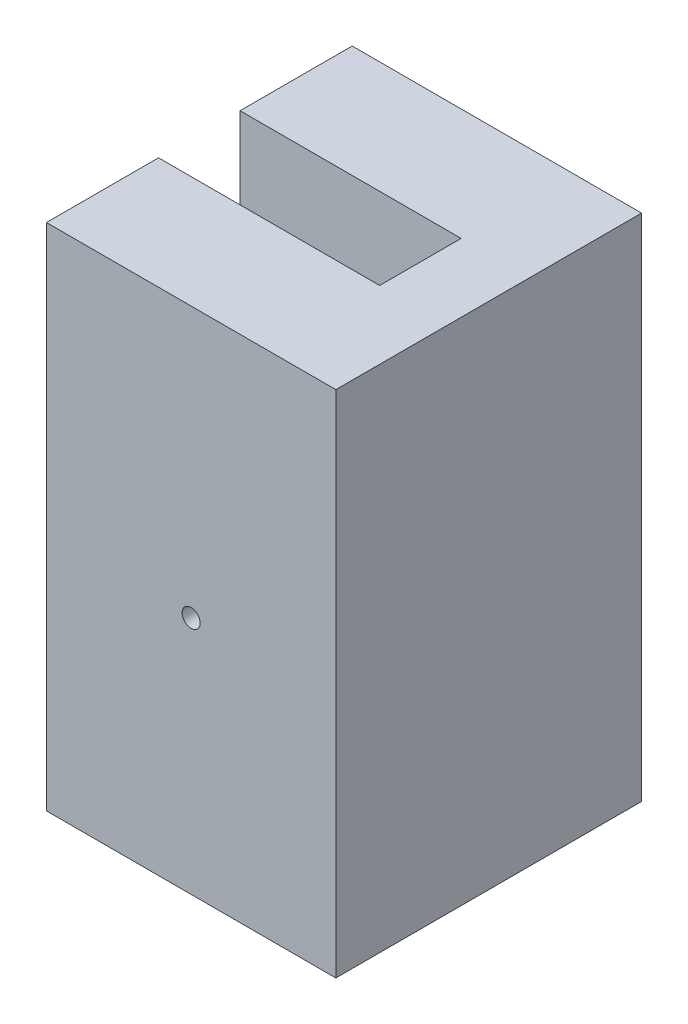
ISO-10303-21;
HEADER;
FILE_DESCRIPTION(('STEP AP214'),'2;1');
FILE_NAME('part.step','',(''),(''),'','','');
FILE_SCHEMA(('AUTOMOTIVE_DESIGN { 1 0 10303 214 1 1 1 1 }'));
ENDSEC;
DATA;
#1=APPLICATION_CONTEXT('core data for automotive mechanical design processes');
#2=APPLICATION_PROTOCOL_DEFINITION('international standard','automotive_design',2000,#1);
#3=PRODUCT_CONTEXT('',#1,'mechanical');
#4=PRODUCT('Part','Part','',(#3));
#5=PRODUCT_RELATED_PRODUCT_CATEGORY('part','',(#4));
#6=PRODUCT_DEFINITION_FORMATION('','',#4);
#7=PRODUCT_DEFINITION_CONTEXT('part definition',#1,'design');
#8=PRODUCT_DEFINITION('design','',#6,#7);
#9=PRODUCT_DEFINITION_SHAPE('','',#8);
#10=(LENGTH_UNIT() NAMED_UNIT(*) SI_UNIT(.MILLI.,.METRE.));
#11=(NAMED_UNIT(*) PLANE_ANGLE_UNIT() SI_UNIT($,.RADIAN.));
#12=(NAMED_UNIT(*) SI_UNIT($,.STERADIAN.) SOLID_ANGLE_UNIT());
#13=UNCERTAINTY_MEASURE_WITH_UNIT(LENGTH_MEASURE(1.E-05),#10,'distance_accuracy_value','');
#14=(GEOMETRIC_REPRESENTATION_CONTEXT(3) GLOBAL_UNCERTAINTY_ASSIGNED_CONTEXT((#13)) GLOBAL_UNIT_ASSIGNED_CONTEXT((#10,
#11,#12)) REPRESENTATION_CONTEXT('',''));
#15=CARTESIAN_POINT('',(0.,0.,0.));
#16=DIRECTION('',(0.,0.,1.));
#17=DIRECTION('',(1.,0.,0.));
#18=AXIS2_PLACEMENT_3D('',#15,#16,#17);
#19=CARTESIAN_POINT('',(-18.034,25.4,5.08));
#20=DIRECTION('',(0.,0.,1.));
#21=DIRECTION('',(1.,0.,0.));
#22=AXIS2_PLACEMENT_3D('',#19,#20,#21);
#23=PLANE('',#22);
#24=CARTESIAN_POINT('',(0.,29.845,5.08));
#25=DIRECTION('',(0.,0.,1.));
#26=DIRECTION('',(1.,0.,0.));
#27=AXIS2_PLACEMENT_3D('',#24,#25,#26);
#28=CIRCLE('',#27,1.125);
#29=CARTESIAN_POINT('',(1.125,29.845,5.08));
#30=VERTEX_POINT('',#29);
#31=EDGE_CURVE('E176',#30,#30,#28,.T.);
#32=ORIENTED_EDGE('',*,*,#31,.T.);
#33=EDGE_LOOP('',(#32));
#34=FACE_BOUND('',#33,.T.);
#35=DIRECTION('',(0.,-1.,0.));
#36=VECTOR('',#35,1.);
#37=CARTESIAN_POINT('',(9.525,25.4,5.08));
#38=LINE('',#37,#36);
#39=CARTESIAN_POINT('',(9.525,63.5,5.08));
#40=VERTEX_POINT('',#39);
#41=CARTESIAN_POINT('',(9.525,25.4,5.08));
#42=VERTEX_POINT('',#41);
#43=EDGE_CURVE('E167',#40,#42,#38,.T.);
#44=ORIENTED_EDGE('',*,*,#43,.T.);
#45=DIRECTION('',(1.,0.,0.));
#46=VECTOR('',#45,1.);
#47=CARTESIAN_POINT('',(-18.034,25.4,5.08));
#48=LINE('',#47,#46);
#49=CARTESIAN_POINT('',(-0.635,25.4,5.08));
#50=VERTEX_POINT('',#49);
#51=EDGE_CURVE('E52',#50,#42,#48,.T.);
#52=ORIENTED_EDGE('',*,*,#51,.F.);
#53=DIRECTION('',(0.,1.,0.));
#54=VECTOR('',#53,1.);
#55=CARTESIAN_POINT('',(-0.635,0.,5.08));
#56=LINE('',#55,#54);
#57=CARTESIAN_POINT('',(-0.635,19.05,5.08));
#58=VERTEX_POINT('',#57);
#59=EDGE_CURVE('E181',#58,#50,#56,.T.);
#60=ORIENTED_EDGE('',*,*,#59,.F.);
#61=DIRECTION('',(1.,0.,0.));
#62=VECTOR('',#61,1.);
#63=CARTESIAN_POINT('',(0.,19.05,5.08));
#64=LINE('',#63,#62);
#65=CARTESIAN_POINT('',(-18.034,19.05,5.08));
#66=VERTEX_POINT('',#65);
#67=EDGE_CURVE('E45',#66,#58,#64,.T.);
#68=ORIENTED_EDGE('',*,*,#67,.F.);
#69=DIRECTION('',(0.,1.,0.));
#70=VECTOR('',#69,1.);
#71=CARTESIAN_POINT('',(-18.034,25.4,5.08));
#72=LINE('',#71,#70);
#73=CARTESIAN_POINT('',(-18.034,63.5,5.08));
#74=VERTEX_POINT('',#73);
#75=EDGE_CURVE('E207',#66,#74,#72,.T.);
#76=ORIENTED_EDGE('',*,*,#75,.T.);
#77=DIRECTION('',(1.,0.,0.));
#78=VECTOR('',#77,1.);
#79=CARTESIAN_POINT('',(-18.034,63.5,5.08));
#80=LINE('',#79,#78);
#81=EDGE_CURVE('E60',#74,#40,#80,.T.);
#82=ORIENTED_EDGE('',*,*,#81,.T.);
#83=EDGE_LOOP('',(#44,#52,#60,#68,#76,#82));
#84=FACE_BOUND('',#83,.T.);
#85=ADVANCED_FACE('F37',(#34,#84),#23,.F.);
#86=CARTESIAN_POINT('',(-18.034,25.4,-5.08));
#87=DIRECTION('',(0.,0.,-1.));
#88=DIRECTION('',(-1.,0.,0.));
#89=AXIS2_PLACEMENT_3D('',#86,#87,#88);
#90=PLANE('',#89);
#91=CARTESIAN_POINT('',(0.,29.845,-5.08));
#92=DIRECTION('',(0.,0.,-1.));
#93=DIRECTION('',(-1.,0.,0.));
#94=AXIS2_PLACEMENT_3D('',#91,#92,#93);
#95=CIRCLE('',#94,1.125);
#96=CARTESIAN_POINT('',(-1.125,29.845,-5.08));
#97=VERTEX_POINT('',#96);
#98=EDGE_CURVE('E175',#97,#97,#95,.T.);
#99=ORIENTED_EDGE('',*,*,#98,.T.);
#100=EDGE_LOOP('',(#99));
#101=FACE_BOUND('',#100,.T.);
#102=DIRECTION('',(-1.,0.,0.));
#103=VECTOR('',#102,1.);
#104=CARTESIAN_POINT('',(-18.034,25.4,-5.08));
#105=LINE('',#104,#103);
#106=CARTESIAN_POINT('',(9.525,25.4,-5.08));
#107=VERTEX_POINT('',#106);
#108=CARTESIAN_POINT('',(-0.635,25.4,-5.08));
#109=VERTEX_POINT('',#108);
#110=EDGE_CURVE('E140',#107,#109,#105,.T.);
#111=ORIENTED_EDGE('',*,*,#110,.F.);
#112=DIRECTION('',(0.,1.,0.));
#113=VECTOR('',#112,1.);
#114=CARTESIAN_POINT('',(9.525,25.4,-5.08));
#115=LINE('',#114,#113);
#116=CARTESIAN_POINT('',(9.525,63.5,-5.08));
#117=VERTEX_POINT('',#116);
#118=EDGE_CURVE('E143',#107,#117,#115,.T.);
#119=ORIENTED_EDGE('',*,*,#118,.T.);
#120=DIRECTION('',(-1.,0.,0.));
#121=VECTOR('',#120,1.);
#122=CARTESIAN_POINT('',(-18.034,63.5,-5.08));
#123=LINE('',#122,#121);
#124=CARTESIAN_POINT('',(-18.034,63.5,-5.08));
#125=VERTEX_POINT('',#124);
#126=EDGE_CURVE('E194',#117,#125,#123,.T.);
#127=ORIENTED_EDGE('',*,*,#126,.T.);
#128=DIRECTION('',(0.,1.,0.));
#129=VECTOR('',#128,1.);
#130=CARTESIAN_POINT('',(-18.034,25.4,-5.08));
#131=LINE('',#130,#129);
#132=CARTESIAN_POINT('',(-18.034,19.05,-5.08));
#133=VERTEX_POINT('',#132);
#134=EDGE_CURVE('E204',#133,#125,#131,.T.);
#135=ORIENTED_EDGE('',*,*,#134,.F.);
#136=DIRECTION('',(-1.,0.,0.));
#137=VECTOR('',#136,1.);
#138=CARTESIAN_POINT('',(0.,19.05,-5.08));
#139=LINE('',#138,#137);
#140=CARTESIAN_POINT('',(-0.635,19.05,-5.08));
#141=VERTEX_POINT('',#140);
#142=EDGE_CURVE('E246',#141,#133,#139,.T.);
#143=ORIENTED_EDGE('',*,*,#142,.F.);
#144=DIRECTION('',(0.,1.,0.));
#145=VECTOR('',#144,1.);
#146=CARTESIAN_POINT('',(-0.635,0.,-5.08));
#147=LINE('',#146,#145);
#148=EDGE_CURVE('E146',#141,#109,#147,.T.);
#149=ORIENTED_EDGE('',*,*,#148,.T.);
#150=EDGE_LOOP('',(#111,#119,#127,#135,#143,#149));
#151=FACE_BOUND('',#150,.T.);
#152=ADVANCED_FACE('F141',(#101,#151),#90,.F.);
#153=CARTESIAN_POINT('',(9.525,-39.0386101315096,-19.05));
#154=DIRECTION('',(-1.,0.,0.));
#155=DIRECTION('',(0.,0.,1.));
#156=AXIS2_PLACEMENT_3D('',#153,#154,#155);
#157=PLANE('',#156);
#158=ORIENTED_EDGE('',*,*,#118,.F.);
#159=DIRECTION('',(0.,0.,-1.));
#160=VECTOR('',#159,1.);
#161=CARTESIAN_POINT('',(9.525,25.4,5.08));
#162=LINE('',#161,#160);
#163=EDGE_CURVE('E149',#42,#107,#162,.T.);
#164=ORIENTED_EDGE('',*,*,#163,.F.);
#165=ORIENTED_EDGE('',*,*,#43,.F.);
#166=DIRECTION('',(0.,0.,1.));
#167=VECTOR('',#166,1.);
#168=CARTESIAN_POINT('',(9.525,63.5,-19.05));
#169=LINE('',#168,#167);
#170=EDGE_CURVE('E152',#117,#40,#169,.T.);
#171=ORIENTED_EDGE('',*,*,#170,.F.);
#172=EDGE_LOOP('',(#158,#164,#165,#171));
#173=FACE_BOUND('',#172,.T.);
#174=ADVANCED_FACE('F155',(#173),#157,.T.);
#175=DIRECTION('',(0.,0.,1.));
#176=VECTOR('',#175,1.);
#177=CARTESIAN_POINT('',(9.525,19.05,0.));
#178=LINE('',#177,#176);
#179=CARTESIAN_POINT('',(9.525,19.05,-8.5725));
#180=VERTEX_POINT('',#179);
#181=CARTESIAN_POINT('',(9.525,19.05,8.5725));
#182=VERTEX_POINT('',#181);
#183=EDGE_CURVE('E161',#180,#182,#178,.T.);
#184=ORIENTED_EDGE('',*,*,#183,.F.);
#185=DIRECTION('',(0.,1.,0.));
#186=VECTOR('',#185,1.);
#187=CARTESIAN_POINT('',(9.525,65.3355937604538,-8.5725));
#188=LINE('',#187,#186);
#189=CARTESIAN_POINT('',(9.525,0.,-8.5725));
#190=VERTEX_POINT('',#189);
#191=EDGE_CURVE('E12',#190,#180,#188,.T.);
#192=ORIENTED_EDGE('',*,*,#191,.F.);
#193=DIRECTION('',(0.,0.,-1.));
#194=VECTOR('',#193,1.);
#195=CARTESIAN_POINT('',(9.525,0.,-19.05));
#196=LINE('',#195,#194);
#197=CARTESIAN_POINT('',(9.525,0.,8.5725));
#198=VERTEX_POINT('',#197);
#199=EDGE_CURVE('E158',#198,#190,#196,.T.);
#200=ORIENTED_EDGE('',*,*,#199,.F.);
#201=DIRECTION('',(0.,-1.,0.));
#202=VECTOR('',#201,1.);
#203=CARTESIAN_POINT('',(9.525,65.3355937604538,8.5725));
#204=LINE('',#203,#202);
#205=EDGE_CURVE('E157',#182,#198,#204,.T.);
#206=ORIENTED_EDGE('',*,*,#205,.F.);
#207=EDGE_LOOP('',(#184,#192,#200,#206));
#208=FACE_BOUND('',#207,.T.);
#209=ADVANCED_FACE('F339',(#208),#157,.T.);
#210=CARTESIAN_POINT('',(-18.034,63.5,-19.05));
#211=DIRECTION('',(1.,0.,0.));
#212=DIRECTION('',(0.,0.,-1.));
#213=AXIS2_PLACEMENT_3D('',#210,#211,#212);
#214=PLANE('',#213);
#215=ORIENTED_EDGE('',*,*,#75,.F.);
#216=DIRECTION('',(0.,0.,-1.));
#217=VECTOR('',#216,1.);
#218=CARTESIAN_POINT('',(-18.034,19.05,-8.5725));
#219=LINE('',#218,#217);
#220=CARTESIAN_POINT('',(-18.034,19.05,8.5725));
#221=VERTEX_POINT('',#220);
#222=EDGE_CURVE('E196',#221,#66,#219,.T.);
#223=ORIENTED_EDGE('',*,*,#222,.F.);
#224=DIRECTION('',(0.,-1.,0.));
#225=VECTOR('',#224,1.);
#226=CARTESIAN_POINT('',(-18.034,65.3355937604538,8.5725));
#227=LINE('',#226,#225);
#228=CARTESIAN_POINT('',(-18.034,0.,8.5725));
#229=VERTEX_POINT('',#228);
#230=EDGE_CURVE('E190',#221,#229,#227,.T.);
#231=ORIENTED_EDGE('',*,*,#230,.T.);
#232=DIRECTION('',(0.,0.,1.));
#233=VECTOR('',#232,1.);
#234=CARTESIAN_POINT('',(-18.034,0.,-19.05));
#235=LINE('',#234,#233);
#236=CARTESIAN_POINT('',(-18.034,0.,19.05));
#237=VERTEX_POINT('',#236);
#238=EDGE_CURVE('E227',#229,#237,#235,.T.);
#239=ORIENTED_EDGE('',*,*,#238,.T.);
#240=DIRECTION('',(0.,-1.,0.));
#241=VECTOR('',#240,1.);
#242=CARTESIAN_POINT('',(-18.034,63.5,19.05));
#243=LINE('',#242,#241);
#244=CARTESIAN_POINT('',(-18.034,63.5,19.05));
#245=VERTEX_POINT('',#244);
#246=EDGE_CURVE('E234',#245,#237,#243,.T.);
#247=ORIENTED_EDGE('',*,*,#246,.F.);
#248=DIRECTION('',(0.,0.,1.));
#249=VECTOR('',#248,1.);
#250=CARTESIAN_POINT('',(-18.034,63.5,-19.05));
#251=LINE('',#250,#249);
#252=EDGE_CURVE('E217',#74,#245,#251,.T.);
#253=ORIENTED_EDGE('',*,*,#252,.F.);
#254=EDGE_LOOP('',(#215,#223,#231,#239,#247,#253));
#255=FACE_BOUND('',#254,.T.);
#256=ADVANCED_FACE('F297',(#255),#214,.F.);
#257=CARTESIAN_POINT('',(0.,25.4,0.));
#258=DIRECTION('',(0.,1.,0.));
#259=DIRECTION('',(0.,0.,1.));
#260=AXIS2_PLACEMENT_3D('',#257,#258,#259);
#261=PLANE('',#260);
#262=DIRECTION('',(0.,0.,-1.));
#263=VECTOR('',#262,1.);
#264=CARTESIAN_POINT('',(-0.635,25.4,0.));
#265=LINE('',#264,#263);
#266=EDGE_CURVE('E179',#50,#109,#265,.T.);
#267=ORIENTED_EDGE('',*,*,#266,.F.);
#268=ORIENTED_EDGE('',*,*,#51,.T.);
#269=ORIENTED_EDGE('',*,*,#163,.T.);
#270=ORIENTED_EDGE('',*,*,#110,.T.);
#271=EDGE_LOOP('',(#267,#268,#269,#270));
#272=FACE_BOUND('',#271,.T.);
#273=ADVANCED_FACE('F150',(#272),#261,.T.);
#274=CARTESIAN_POINT('',(18.034,63.5,-19.05));
#275=DIRECTION('',(-1.,0.,0.));
#276=DIRECTION('',(0.,0.,1.));
#277=AXIS2_PLACEMENT_3D('',#274,#275,#276);
#278=PLANE('',#277);
#279=DIRECTION('',(0.,-1.,0.));
#280=VECTOR('',#279,1.);
#281=CARTESIAN_POINT('',(18.034,63.5,-19.05));
#282=LINE('',#281,#280);
#283=CARTESIAN_POINT('',(18.034,63.5,-19.05));
#284=VERTEX_POINT('',#283);
#285=CARTESIAN_POINT('',(18.034,0.,-19.05));
#286=VERTEX_POINT('',#285);
#287=EDGE_CURVE('E240',#284,#286,#282,.T.);
#288=ORIENTED_EDGE('',*,*,#287,.F.);
#289=DIRECTION('',(0.,0.,-1.));
#290=VECTOR('',#289,1.);
#291=CARTESIAN_POINT('',(18.034,63.5,-19.05));
#292=LINE('',#291,#290);
#293=CARTESIAN_POINT('',(18.034,63.5,19.05));
#294=VERTEX_POINT('',#293);
#295=EDGE_CURVE('E212',#294,#284,#292,.T.);
#296=ORIENTED_EDGE('',*,*,#295,.F.);
#297=DIRECTION('',(0.,-1.,0.));
#298=VECTOR('',#297,1.);
#299=CARTESIAN_POINT('',(18.034,63.5,19.05));
#300=LINE('',#299,#298);
#301=CARTESIAN_POINT('',(18.034,0.,19.05));
#302=VERTEX_POINT('',#301);
#303=EDGE_CURVE('E223',#294,#302,#300,.T.);
#304=ORIENTED_EDGE('',*,*,#303,.T.);
#305=DIRECTION('',(0.,0.,-1.));
#306=VECTOR('',#305,1.);
#307=CARTESIAN_POINT('',(18.034,0.,-19.05));
#308=LINE('',#307,#306);
#309=EDGE_CURVE('E209',#302,#286,#308,.T.);
#310=ORIENTED_EDGE('',*,*,#309,.T.);
#311=EDGE_LOOP('',(#288,#296,#304,#310));
#312=FACE_BOUND('',#311,.T.);
#313=ADVANCED_FACE('F39',(#312),#278,.F.);
#314=CARTESIAN_POINT('',(-18.034,63.5,-19.05));
#315=DIRECTION('',(0.,0.,1.));
#316=DIRECTION('',(1.,0.,0.));
#317=AXIS2_PLACEMENT_3D('',#314,#315,#316);
#318=PLANE('',#317);
#319=CARTESIAN_POINT('',(0.,29.845,-19.05));
#320=DIRECTION('',(0.,0.,1.));
#321=DIRECTION('',(1.,0.,0.));
#322=AXIS2_PLACEMENT_3D('',#319,#320,#321);
#323=CIRCLE('',#322,1.125);
#324=CARTESIAN_POINT('',(1.125,29.845,-19.05));
#325=VERTEX_POINT('',#324);
#326=EDGE_CURVE('E172',#325,#325,#323,.T.);
#327=ORIENTED_EDGE('',*,*,#326,.T.);
#328=EDGE_LOOP('',(#327));
#329=FACE_BOUND('',#328,.T.);
#330=DIRECTION('',(0.,-1.,0.));
#331=VECTOR('',#330,1.);
#332=CARTESIAN_POINT('',(-18.034,63.5,-19.05));
#333=LINE('',#332,#331);
#334=CARTESIAN_POINT('',(-18.034,63.5,-19.05));
#335=VERTEX_POINT('',#334);
#336=CARTESIAN_POINT('',(-18.034,0.,-19.05));
#337=VERTEX_POINT('',#336);
#338=EDGE_CURVE('E237',#335,#337,#333,.T.);
#339=ORIENTED_EDGE('',*,*,#338,.F.);
#340=DIRECTION('',(-1.,0.,0.));
#341=VECTOR('',#340,1.);
#342=CARTESIAN_POINT('',(-18.034,63.5,-19.05));
#343=LINE('',#342,#341);
#344=EDGE_CURVE('E214',#284,#335,#343,.T.);
#345=ORIENTED_EDGE('',*,*,#344,.F.);
#346=ORIENTED_EDGE('',*,*,#287,.T.);
#347=DIRECTION('',(-1.,0.,0.));
#348=VECTOR('',#347,1.);
#349=CARTESIAN_POINT('',(-18.034,0.,-19.05));
#350=LINE('',#349,#348);
#351=EDGE_CURVE('E225',#286,#337,#350,.T.);
#352=ORIENTED_EDGE('',*,*,#351,.T.);
#353=EDGE_LOOP('',(#339,#345,#346,#352));
#354=FACE_BOUND('',#353,.T.);
#355=ADVANCED_FACE('F295',(#329,#354),#318,.F.);
#356=CARTESIAN_POINT('',(-18.034,19.05,-8.5725));
#357=VERTEX_POINT('',#356);
#358=EDGE_CURVE('E199',#133,#357,#219,.T.);
#359=ORIENTED_EDGE('',*,*,#358,.F.);
#360=ORIENTED_EDGE('',*,*,#134,.T.);
#361=EDGE_CURVE('E218',#335,#125,#251,.T.);
#362=ORIENTED_EDGE('',*,*,#361,.F.);
#363=ORIENTED_EDGE('',*,*,#338,.T.);
#364=CARTESIAN_POINT('',(-18.034,0.,-8.5725));
#365=VERTEX_POINT('',#364);
#366=EDGE_CURVE('E228',#337,#365,#235,.T.);
#367=ORIENTED_EDGE('',*,*,#366,.T.);
#368=DIRECTION('',(0.,-1.,0.));
#369=VECTOR('',#368,1.);
#370=CARTESIAN_POINT('',(-18.034,65.3355937604538,-8.5725));
#371=LINE('',#370,#369);
#372=EDGE_CURVE('E195',#357,#365,#371,.T.);
#373=ORIENTED_EDGE('',*,*,#372,.F.);
#374=EDGE_LOOP('',(#359,#360,#362,#363,#367,#373));
#375=FACE_BOUND('',#374,.T.);
#376=ADVANCED_FACE('F292',(#375),#214,.F.);
#377=CARTESIAN_POINT('',(-18.034,63.5,19.05));
#378=DIRECTION('',(0.,0.,-1.));
#379=DIRECTION('',(-1.,0.,0.));
#380=AXIS2_PLACEMENT_3D('',#377,#378,#379);
#381=PLANE('',#380);
#382=CARTESIAN_POINT('',(0.,29.845,19.05));
#383=DIRECTION('',(0.,0.,1.));
#384=DIRECTION('',(1.,0.,0.));
#385=AXIS2_PLACEMENT_3D('',#382,#383,#384);
#386=CIRCLE('',#385,1.125);
#387=CARTESIAN_POINT('',(1.125,29.845,19.05));
#388=VERTEX_POINT('',#387);
#389=EDGE_CURVE('E169',#388,#388,#386,.T.);
#390=ORIENTED_EDGE('',*,*,#389,.F.);
#391=EDGE_LOOP('',(#390));
#392=FACE_BOUND('',#391,.T.);
#393=DIRECTION('',(1.,0.,0.));
#394=VECTOR('',#393,1.);
#395=CARTESIAN_POINT('',(-18.034,0.,19.05));
#396=LINE('',#395,#394);
#397=EDGE_CURVE('E215',#237,#302,#396,.T.);
#398=ORIENTED_EDGE('',*,*,#397,.T.);
#399=ORIENTED_EDGE('',*,*,#303,.F.);
#400=DIRECTION('',(1.,0.,0.));
#401=VECTOR('',#400,1.);
#402=CARTESIAN_POINT('',(-18.034,63.5,19.05));
#403=LINE('',#402,#401);
#404=EDGE_CURVE('E221',#245,#294,#403,.T.);
#405=ORIENTED_EDGE('',*,*,#404,.F.);
#406=ORIENTED_EDGE('',*,*,#246,.T.);
#407=EDGE_LOOP('',(#398,#399,#405,#406));
#408=FACE_BOUND('',#407,.T.);
#409=ADVANCED_FACE('F284',(#392,#408),#381,.F.);
#410=CARTESIAN_POINT('',(0.,63.5,0.));
#411=DIRECTION('',(0.,1.,0.));
#412=DIRECTION('',(0.,0.,1.));
#413=AXIS2_PLACEMENT_3D('',#410,#411,#412);
#414=PLANE('',#413);
#415=ORIENTED_EDGE('',*,*,#126,.F.);
#416=ORIENTED_EDGE('',*,*,#170,.T.);
#417=ORIENTED_EDGE('',*,*,#81,.F.);
#418=ORIENTED_EDGE('',*,*,#252,.T.);
#419=ORIENTED_EDGE('',*,*,#404,.T.);
#420=ORIENTED_EDGE('',*,*,#295,.T.);
#421=ORIENTED_EDGE('',*,*,#344,.T.);
#422=ORIENTED_EDGE('',*,*,#361,.T.);
#423=EDGE_LOOP('',(#415,#416,#417,#418,#419,#420,#421,#422));
#424=FACE_BOUND('',#423,.T.);
#425=ADVANCED_FACE('F280',(#424),#414,.T.);
#426=CARTESIAN_POINT('',(0.,0.,0.));
#427=DIRECTION('',(0.,1.,0.));
#428=DIRECTION('',(0.,0.,1.));
#429=AXIS2_PLACEMENT_3D('',#426,#427,#428);
#430=PLANE('',#429);
#431=ORIENTED_EDGE('',*,*,#366,.F.);
#432=ORIENTED_EDGE('',*,*,#351,.F.);
#433=ORIENTED_EDGE('',*,*,#309,.F.);
#434=ORIENTED_EDGE('',*,*,#397,.F.);
#435=ORIENTED_EDGE('',*,*,#238,.F.);
#436=DIRECTION('',(-1.,0.,0.));
#437=VECTOR('',#436,1.);
#438=CARTESIAN_POINT('',(-18.034,0.,8.5725));
#439=LINE('',#438,#437);
#440=EDGE_CURVE('E183',#198,#229,#439,.T.);
#441=ORIENTED_EDGE('',*,*,#440,.F.);
#442=ORIENTED_EDGE('',*,*,#199,.T.);
#443=DIRECTION('',(1.,0.,0.));
#444=VECTOR('',#443,1.);
#445=CARTESIAN_POINT('',(-18.034,0.,-8.5725));
#446=LINE('',#445,#444);
#447=EDGE_CURVE('E185',#365,#190,#446,.T.);
#448=ORIENTED_EDGE('',*,*,#447,.F.);
#449=EDGE_LOOP('',(#431,#432,#433,#434,#435,#441,#442,#448));
#450=FACE_BOUND('',#449,.T.);
#451=ADVANCED_FACE('F283',(#450),#430,.F.);
#452=CARTESIAN_POINT('',(0.,19.05,0.));
#453=DIRECTION('',(0.,1.,0.));
#454=DIRECTION('',(0.,0.,1.));
#455=AXIS2_PLACEMENT_3D('',#452,#453,#454);
#456=PLANE('',#455);
#457=DIRECTION('',(1.,0.,0.));
#458=VECTOR('',#457,1.);
#459=CARTESIAN_POINT('',(-18.034,19.05,-8.5725));
#460=LINE('',#459,#458);
#461=EDGE_CURVE('E191',#357,#180,#460,.T.);
#462=ORIENTED_EDGE('',*,*,#461,.T.);
#463=ORIENTED_EDGE('',*,*,#183,.T.);
#464=DIRECTION('',(-1.,0.,0.));
#465=VECTOR('',#464,1.);
#466=CARTESIAN_POINT('',(-18.034,19.05,8.5725));
#467=LINE('',#466,#465);
#468=EDGE_CURVE('E187',#182,#221,#467,.T.);
#469=ORIENTED_EDGE('',*,*,#468,.T.);
#470=ORIENTED_EDGE('',*,*,#222,.T.);
#471=ORIENTED_EDGE('',*,*,#67,.T.);
#472=DIRECTION('',(0.,0.,-1.));
#473=VECTOR('',#472,1.);
#474=CARTESIAN_POINT('',(-0.635,19.05,0.));
#475=LINE('',#474,#473);
#476=EDGE_CURVE('E243',#58,#141,#475,.T.);
#477=ORIENTED_EDGE('',*,*,#476,.T.);
#478=ORIENTED_EDGE('',*,*,#142,.T.);
#479=ORIENTED_EDGE('',*,*,#358,.T.);
#480=EDGE_LOOP('',(#462,#463,#469,#470,#471,#477,#478,#479));
#481=FACE_BOUND('',#480,.T.);
#482=ADVANCED_FACE('F288',(#481),#456,.F.);
#483=CARTESIAN_POINT('',(-18.034,65.3355937604538,8.5725));
#484=DIRECTION('',(0.,0.,1.));
#485=DIRECTION('',(1.,0.,0.));
#486=AXIS2_PLACEMENT_3D('',#483,#484,#485);
#487=PLANE('',#486);
#488=ORIENTED_EDGE('',*,*,#468,.F.);
#489=ORIENTED_EDGE('',*,*,#205,.T.);
#490=ORIENTED_EDGE('',*,*,#440,.T.);
#491=ORIENTED_EDGE('',*,*,#230,.F.);
#492=EDGE_LOOP('',(#488,#489,#490,#491));
#493=FACE_BOUND('',#492,.T.);
#494=ADVANCED_FACE('F337',(#493),#487,.F.);
#495=CARTESIAN_POINT('',(-18.034,65.3355937604538,-8.5725));
#496=DIRECTION('',(0.,0.,-1.));
#497=DIRECTION('',(-1.,0.,0.));
#498=AXIS2_PLACEMENT_3D('',#495,#496,#497);
#499=PLANE('',#498);
#500=ORIENTED_EDGE('',*,*,#447,.T.);
#501=ORIENTED_EDGE('',*,*,#191,.T.);
#502=ORIENTED_EDGE('',*,*,#461,.F.);
#503=ORIENTED_EDGE('',*,*,#372,.T.);
#504=EDGE_LOOP('',(#500,#501,#502,#503));
#505=FACE_BOUND('',#504,.T.);
#506=ADVANCED_FACE('F265',(#505),#499,.F.);
#507=CARTESIAN_POINT('',(-0.635,0.,0.));
#508=DIRECTION('',(1.,0.,0.));
#509=DIRECTION('',(0.,0.,-1.));
#510=AXIS2_PLACEMENT_3D('',#507,#508,#509);
#511=PLANE('',#510);
#512=ORIENTED_EDGE('',*,*,#59,.T.);
#513=ORIENTED_EDGE('',*,*,#266,.T.);
#514=ORIENTED_EDGE('',*,*,#148,.F.);
#515=ORIENTED_EDGE('',*,*,#476,.F.);
#516=EDGE_LOOP('',(#512,#513,#514,#515));
#517=FACE_BOUND('',#516,.T.);
#518=ADVANCED_FACE('F257',(#517),#511,.F.);
#519=CARTESIAN_POINT('',(0.,29.845,-19.05));
#520=DIRECTION('',(0.,0.,1.));
#521=DIRECTION('',(1.,0.,0.));
#522=AXIS2_PLACEMENT_3D('',#519,#520,#521);
#523=CYLINDRICAL_SURFACE('',#522,1.125);
#524=ORIENTED_EDGE('',*,*,#326,.F.);
#525=EDGE_LOOP('',(#524));
#526=FACE_BOUND('',#525,.T.);
#527=ORIENTED_EDGE('',*,*,#98,.F.);
#528=EDGE_LOOP('',(#527));
#529=FACE_BOUND('',#528,.T.);
#530=ADVANCED_FACE('F254',(#526,#529),#523,.F.);
#531=ORIENTED_EDGE('',*,*,#389,.T.);
#532=EDGE_LOOP('',(#531));
#533=FACE_BOUND('',#532,.T.);
#534=ORIENTED_EDGE('',*,*,#31,.F.);
#535=EDGE_LOOP('',(#534));
#536=FACE_BOUND('',#535,.T.);
#537=ADVANCED_FACE('F256',(#533,#536),#523,.F.);
#538=CLOSED_SHELL('',(#85,#152,#174,#209,#256,#273,#313,#355,#376,#409,#425,#451,#482,#494,#506,
#518,#530,#537));
#539=MANIFOLD_SOLID_BREP('B2',#538);
#540=ADVANCED_BREP_SHAPE_REPRESENTATION('',(#18,#539),#14);
#541=SHAPE_DEFINITION_REPRESENTATION(#9,#540);
ENDSEC;
END-ISO-10303-21;
